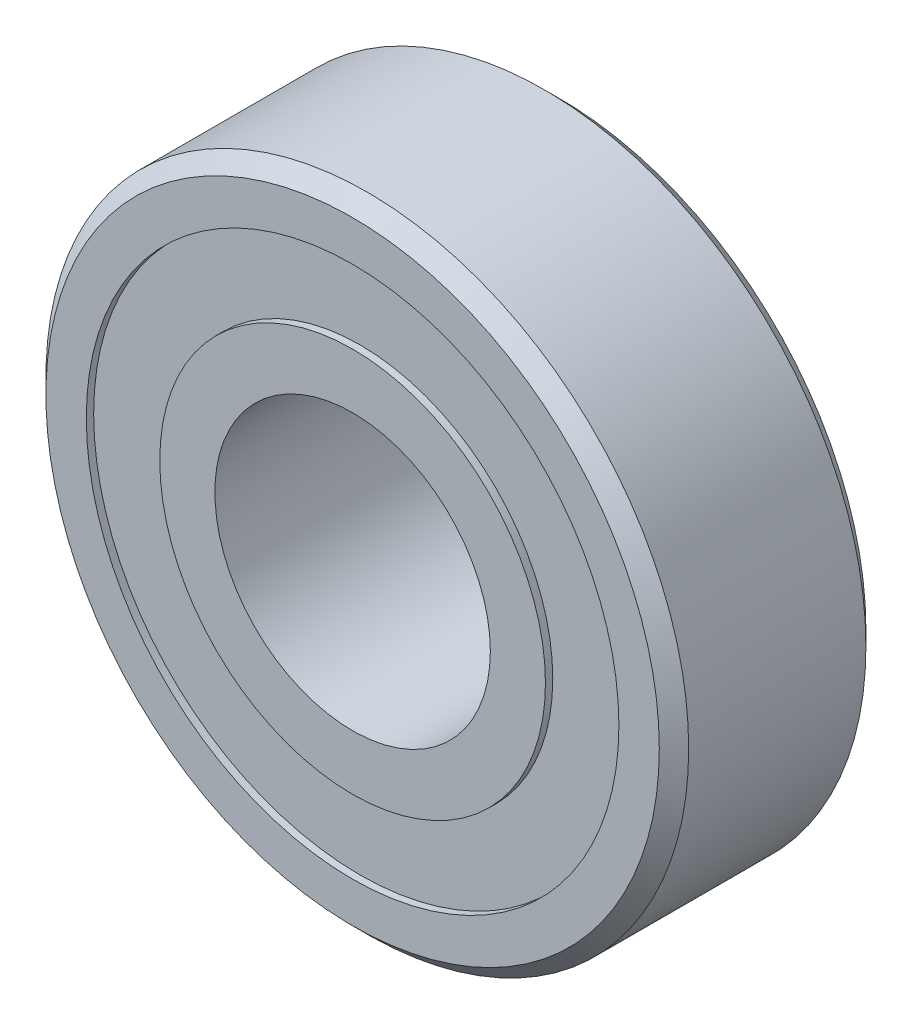
ISO-10303-21;
HEADER;
FILE_DESCRIPTION(('STEP AP214'),'2;1');
FILE_NAME('part.step','',(''),(''),'','','');
FILE_SCHEMA(('AUTOMOTIVE_DESIGN { 1 0 10303 214 1 1 1 1 }'));
ENDSEC;
DATA;
#1=APPLICATION_CONTEXT('core data for automotive mechanical design processes');
#2=APPLICATION_PROTOCOL_DEFINITION('international standard','automotive_design',2000,#1);
#3=PRODUCT_CONTEXT('',#1,'mechanical');
#4=PRODUCT('Part','Part','',(#3));
#5=PRODUCT_RELATED_PRODUCT_CATEGORY('part','',(#4));
#6=PRODUCT_DEFINITION_FORMATION('','',#4);
#7=PRODUCT_DEFINITION_CONTEXT('part definition',#1,'design');
#8=PRODUCT_DEFINITION('design','',#6,#7);
#9=PRODUCT_DEFINITION_SHAPE('','',#8);
#10=(LENGTH_UNIT() NAMED_UNIT(*) SI_UNIT(.MILLI.,.METRE.));
#11=(NAMED_UNIT(*) PLANE_ANGLE_UNIT() SI_UNIT($,.RADIAN.));
#12=(NAMED_UNIT(*) SI_UNIT($,.STERADIAN.) SOLID_ANGLE_UNIT());
#13=UNCERTAINTY_MEASURE_WITH_UNIT(LENGTH_MEASURE(1.E-05),#10,'distance_accuracy_value','');
#14=(GEOMETRIC_REPRESENTATION_CONTEXT(3) GLOBAL_UNCERTAINTY_ASSIGNED_CONTEXT((#13)) GLOBAL_UNIT_ASSIGNED_CONTEXT((#10,
#11,#12)) REPRESENTATION_CONTEXT('',''));
#15=CARTESIAN_POINT('',(0.,0.,0.));
#16=DIRECTION('',(0.,0.,1.));
#17=DIRECTION('',(1.,0.,0.));
#18=AXIS2_PLACEMENT_3D('',#15,#16,#17);
#19=CARTESIAN_POINT('',(0.,0.,0.));
#20=DIRECTION('',(0.,0.,1.));
#21=DIRECTION('',(1.,0.,0.));
#22=AXIS2_PLACEMENT_3D('',#19,#20,#21);
#23=PLANE('',#22);
#24=CARTESIAN_POINT('',(0.,0.,0.));
#25=DIRECTION('',(0.,0.,1.));
#26=DIRECTION('',(1.,0.,0.));
#27=AXIS2_PLACEMENT_3D('',#24,#25,#26);
#28=CIRCLE('',#27,4.76249999999998);
#29=CARTESIAN_POINT('',(4.76249999999998,0.,0.));
#30=VERTEX_POINT('',#29);
#31=EDGE_CURVE('E53',#30,#30,#28,.T.);
#32=ORIENTED_EDGE('',*,*,#31,.T.);
#33=EDGE_LOOP('',(#32));
#34=FACE_BOUND('',#33,.T.);
#35=CARTESIAN_POINT('',(0.,0.,0.));
#36=DIRECTION('',(0.,0.,-1.));
#37=DIRECTION('',(-1.,0.,0.));
#38=AXIS2_PLACEMENT_3D('',#35,#36,#37);
#39=CIRCLE('',#38,6.6675);
#40=CARTESIAN_POINT('',(-6.6675,0.,0.));
#41=VERTEX_POINT('',#40);
#42=EDGE_CURVE('E78',#41,#41,#39,.T.);
#43=ORIENTED_EDGE('',*,*,#42,.T.);
#44=EDGE_LOOP('',(#43));
#45=FACE_BOUND('',#44,.T.);
#46=ADVANCED_FACE('F33',(#34,#45),#23,.F.);
#47=CARTESIAN_POINT('',(0.,0.,7.14375));
#48=DIRECTION('',(0.,0.,1.));
#49=DIRECTION('',(1.,0.,0.));
#50=AXIS2_PLACEMENT_3D('',#47,#48,#49);
#51=PLANE('',#50);
#52=CARTESIAN_POINT('',(0.,0.,7.14375));
#53=DIRECTION('',(0.,0.,1.));
#54=DIRECTION('',(1.,0.,0.));
#55=AXIS2_PLACEMENT_3D('',#52,#53,#54);
#56=CIRCLE('',#55,4.76249999999999);
#57=CARTESIAN_POINT('',(4.76249999999999,0.,7.14375));
#58=VERTEX_POINT('',#57);
#59=EDGE_CURVE('E56',#58,#58,#56,.T.);
#60=ORIENTED_EDGE('',*,*,#59,.F.);
#61=EDGE_LOOP('',(#60));
#62=FACE_BOUND('',#61,.T.);
#63=CARTESIAN_POINT('',(0.,0.,7.14375));
#64=DIRECTION('',(0.,0.,1.));
#65=DIRECTION('',(1.,0.,0.));
#66=AXIS2_PLACEMENT_3D('',#63,#64,#65);
#67=CIRCLE('',#66,6.6675);
#68=CARTESIAN_POINT('',(6.6675,0.,7.14375));
#69=VERTEX_POINT('',#68);
#70=EDGE_CURVE('E66',#69,#69,#67,.T.);
#71=ORIENTED_EDGE('',*,*,#70,.T.);
#72=EDGE_LOOP('',(#71));
#73=FACE_BOUND('',#72,.T.);
#74=ADVANCED_FACE('F113',(#62,#73),#51,.T.);
#75=CARTESIAN_POINT('',(0.,0.,7.14375));
#76=DIRECTION('',(0.,0.,-1.));
#77=DIRECTION('',(-1.,0.,0.));
#78=AXIS2_PLACEMENT_3D('',#75,#76,#77);
#79=CYLINDRICAL_SURFACE('',#78,11.1125);
#80=CARTESIAN_POINT('',(0.,0.,0.507999999999996));
#81=DIRECTION('',(0.,0.,1.));
#82=DIRECTION('',(1.,0.,0.));
#83=AXIS2_PLACEMENT_3D('',#80,#81,#82);
#84=CIRCLE('',#83,11.1125);
#85=CARTESIAN_POINT('',(11.1125,0.,0.507999999999996));
#86=VERTEX_POINT('',#85);
#87=EDGE_CURVE('E44',#86,#86,#84,.T.);
#88=ORIENTED_EDGE('',*,*,#87,.T.);
#89=EDGE_LOOP('',(#88));
#90=FACE_BOUND('',#89,.T.);
#91=CARTESIAN_POINT('',(0.,0.,6.63575));
#92=DIRECTION('',(0.,0.,1.));
#93=DIRECTION('',(1.,0.,0.));
#94=AXIS2_PLACEMENT_3D('',#91,#92,#93);
#95=CIRCLE('',#94,11.1125);
#96=CARTESIAN_POINT('',(11.1125,0.,6.63575));
#97=VERTEX_POINT('',#96);
#98=EDGE_CURVE('E48',#97,#97,#95,.F.);
#99=ORIENTED_EDGE('',*,*,#98,.T.);
#100=EDGE_LOOP('',(#99));
#101=FACE_BOUND('',#100,.T.);
#102=ADVANCED_FACE('F110',(#90,#101),#79,.T.);
#103=CARTESIAN_POINT('',(0.,0.,7.14375));
#104=DIRECTION('',(0.,0.,1.));
#105=DIRECTION('',(1.,0.,0.));
#106=AXIS2_PLACEMENT_3D('',#103,#104,#105);
#107=CIRCLE('',#106,9.2075);
#108=CARTESIAN_POINT('',(9.2075,0.,7.14375));
#109=VERTEX_POINT('',#108);
#110=EDGE_CURVE('E60',#109,#109,#107,.T.);
#111=ORIENTED_EDGE('',*,*,#110,.F.);
#112=EDGE_LOOP('',(#111));
#113=FACE_BOUND('',#112,.T.);
#114=CARTESIAN_POINT('',(0.,0.,7.14375));
#115=DIRECTION('',(0.,0.,1.));
#116=DIRECTION('',(1.,0.,0.));
#117=AXIS2_PLACEMENT_3D('',#114,#115,#116);
#118=CIRCLE('',#117,10.6045);
#119=CARTESIAN_POINT('',(10.6045,0.,7.14375));
#120=VERTEX_POINT('',#119);
#121=EDGE_CURVE('E10',#120,#120,#118,.T.);
#122=ORIENTED_EDGE('',*,*,#121,.T.);
#123=EDGE_LOOP('',(#122));
#124=FACE_BOUND('',#123,.T.);
#125=ADVANCED_FACE('F103',(#113,#124),#51,.T.);
#126=CARTESIAN_POINT('',(0.,0.,0.));
#127=DIRECTION('',(0.,0.,-1.));
#128=DIRECTION('',(-1.,0.,0.));
#129=AXIS2_PLACEMENT_3D('',#126,#127,#128);
#130=CIRCLE('',#129,9.2075);
#131=CARTESIAN_POINT('',(-9.2075,0.,0.));
#132=VERTEX_POINT('',#131);
#133=EDGE_CURVE('E72',#132,#132,#130,.T.);
#134=ORIENTED_EDGE('',*,*,#133,.F.);
#135=EDGE_LOOP('',(#134));
#136=FACE_BOUND('',#135,.T.);
#137=CARTESIAN_POINT('',(0.,0.,0.));
#138=DIRECTION('',(0.,0.,1.));
#139=DIRECTION('',(1.,0.,0.));
#140=AXIS2_PLACEMENT_3D('',#137,#138,#139);
#141=CIRCLE('',#140,10.6045);
#142=CARTESIAN_POINT('',(10.6045,0.,0.));
#143=VERTEX_POINT('',#142);
#144=EDGE_CURVE('E40',#143,#143,#141,.F.);
#145=ORIENTED_EDGE('',*,*,#144,.T.);
#146=EDGE_LOOP('',(#145));
#147=FACE_BOUND('',#146,.T.);
#148=ADVANCED_FACE('F100',(#136,#147),#23,.F.);
#149=CARTESIAN_POINT('',(0.,0.,0.507999999999996));
#150=DIRECTION('',(0.,0.,1.));
#151=DIRECTION('',(1.,0.,0.));
#152=AXIS2_PLACEMENT_3D('',#149,#150,#151);
#153=CONICAL_SURFACE('',#152,11.1125,0.785398163397452);
#154=ORIENTED_EDGE('',*,*,#144,.F.);
#155=EDGE_LOOP('',(#154));
#156=FACE_BOUND('',#155,.T.);
#157=ORIENTED_EDGE('',*,*,#87,.F.);
#158=EDGE_LOOP('',(#157));
#159=FACE_BOUND('',#158,.T.);
#160=ADVANCED_FACE('F102',(#156,#159),#153,.T.);
#161=CARTESIAN_POINT('',(0.,0.,7.14375));
#162=DIRECTION('',(0.,0.,-1.));
#163=DIRECTION('',(-1.,0.,0.));
#164=AXIS2_PLACEMENT_3D('',#161,#162,#163);
#165=CONICAL_SURFACE('',#164,10.6045,0.785398163397448);
#166=ORIENTED_EDGE('',*,*,#98,.F.);
#167=EDGE_LOOP('',(#166));
#168=FACE_BOUND('',#167,.T.);
#169=ORIENTED_EDGE('',*,*,#121,.F.);
#170=EDGE_LOOP('',(#169));
#171=FACE_BOUND('',#170,.T.);
#172=ADVANCED_FACE('F35',(#168,#171),#165,.T.);
#173=CARTESIAN_POINT('',(0.,0.,7.14375));
#174=DIRECTION('',(0.,0.,1.));
#175=DIRECTION('',(1.,0.,0.));
#176=AXIS2_PLACEMENT_3D('',#173,#174,#175);
#177=CYLINDRICAL_SURFACE('',#176,4.76249999999999);
#178=ORIENTED_EDGE('',*,*,#31,.F.);
#179=EDGE_LOOP('',(#178));
#180=FACE_BOUND('',#179,.T.);
#181=ORIENTED_EDGE('',*,*,#59,.T.);
#182=EDGE_LOOP('',(#181));
#183=FACE_BOUND('',#182,.T.);
#184=ADVANCED_FACE('F139',(#180,#183),#177,.F.);
#185=CARTESIAN_POINT('',(0.,0.,6.88975));
#186=DIRECTION('',(0.,0.,1.));
#187=DIRECTION('',(1.,0.,0.));
#188=AXIS2_PLACEMENT_3D('',#185,#186,#187);
#189=CYLINDRICAL_SURFACE('',#188,9.2075);
#190=CARTESIAN_POINT('',(0.,0.,6.88975));
#191=DIRECTION('',(0.,0.,1.));
#192=DIRECTION('',(1.,0.,0.));
#193=AXIS2_PLACEMENT_3D('',#190,#191,#192);
#194=CIRCLE('',#193,9.2075);
#195=CARTESIAN_POINT('',(9.2075,0.,6.88975));
#196=VERTEX_POINT('',#195);
#197=EDGE_CURVE('E59',#196,#196,#194,.T.);
#198=ORIENTED_EDGE('',*,*,#197,.F.);
#199=EDGE_LOOP('',(#198));
#200=FACE_BOUND('',#199,.T.);
#201=ORIENTED_EDGE('',*,*,#110,.T.);
#202=EDGE_LOOP('',(#201));
#203=FACE_BOUND('',#202,.T.);
#204=ADVANCED_FACE('F135',(#200,#203),#189,.F.);
#205=CARTESIAN_POINT('',(0.,0.,6.88975));
#206=DIRECTION('',(0.,0.,1.));
#207=DIRECTION('',(1.,0.,0.));
#208=AXIS2_PLACEMENT_3D('',#205,#206,#207);
#209=PLANE('',#208);
#210=CARTESIAN_POINT('',(0.,0.,6.88975));
#211=DIRECTION('',(0.,0.,1.));
#212=DIRECTION('',(1.,0.,0.));
#213=AXIS2_PLACEMENT_3D('',#210,#211,#212);
#214=CIRCLE('',#213,6.6675);
#215=CARTESIAN_POINT('',(6.6675,0.,6.88975));
#216=VERTEX_POINT('',#215);
#217=EDGE_CURVE('E63',#216,#216,#214,.T.);
#218=ORIENTED_EDGE('',*,*,#217,.F.);
#219=EDGE_LOOP('',(#218));
#220=FACE_BOUND('',#219,.T.);
#221=ORIENTED_EDGE('',*,*,#197,.T.);
#222=EDGE_LOOP('',(#221));
#223=FACE_BOUND('',#222,.T.);
#224=ADVANCED_FACE('F131',(#220,#223),#209,.T.);
#225=CARTESIAN_POINT('',(0.,0.,6.88975));
#226=DIRECTION('',(0.,0.,1.));
#227=DIRECTION('',(1.,0.,0.));
#228=AXIS2_PLACEMENT_3D('',#225,#226,#227);
#229=CYLINDRICAL_SURFACE('',#228,6.6675);
#230=ORIENTED_EDGE('',*,*,#217,.T.);
#231=EDGE_LOOP('',(#230));
#232=FACE_BOUND('',#231,.T.);
#233=ORIENTED_EDGE('',*,*,#70,.F.);
#234=EDGE_LOOP('',(#233));
#235=FACE_BOUND('',#234,.T.);
#236=ADVANCED_FACE('F96',(#232,#235),#229,.T.);
#237=CARTESIAN_POINT('',(0.,0.,0.254));
#238=DIRECTION('',(0.,0.,-1.));
#239=DIRECTION('',(-1.,0.,0.));
#240=AXIS2_PLACEMENT_3D('',#237,#238,#239);
#241=CYLINDRICAL_SURFACE('',#240,9.2075);
#242=CARTESIAN_POINT('',(0.,0.,0.254));
#243=DIRECTION('',(0.,0.,-1.));
#244=DIRECTION('',(-1.,0.,0.));
#245=AXIS2_PLACEMENT_3D('',#242,#243,#244);
#246=CIRCLE('',#245,9.2075);
#247=CARTESIAN_POINT('',(-9.2075,0.,0.254));
#248=VERTEX_POINT('',#247);
#249=EDGE_CURVE('E69',#248,#248,#246,.T.);
#250=ORIENTED_EDGE('',*,*,#249,.F.);
#251=EDGE_LOOP('',(#250));
#252=FACE_BOUND('',#251,.T.);
#253=ORIENTED_EDGE('',*,*,#133,.T.);
#254=EDGE_LOOP('',(#253));
#255=FACE_BOUND('',#254,.T.);
#256=ADVANCED_FACE('F90',(#252,#255),#241,.F.);
#257=CARTESIAN_POINT('',(0.,0.,0.254));
#258=DIRECTION('',(0.,0.,-1.));
#259=DIRECTION('',(-1.,0.,0.));
#260=AXIS2_PLACEMENT_3D('',#257,#258,#259);
#261=PLANE('',#260);
#262=CARTESIAN_POINT('',(0.,0.,0.254));
#263=DIRECTION('',(0.,0.,-1.));
#264=DIRECTION('',(-1.,0.,0.));
#265=AXIS2_PLACEMENT_3D('',#262,#263,#264);
#266=CIRCLE('',#265,6.6675);
#267=CARTESIAN_POINT('',(-6.6675,0.,0.254));
#268=VERTEX_POINT('',#267);
#269=EDGE_CURVE('E75',#268,#268,#266,.T.);
#270=ORIENTED_EDGE('',*,*,#269,.F.);
#271=EDGE_LOOP('',(#270));
#272=FACE_BOUND('',#271,.T.);
#273=ORIENTED_EDGE('',*,*,#249,.T.);
#274=EDGE_LOOP('',(#273));
#275=FACE_BOUND('',#274,.T.);
#276=ADVANCED_FACE('F87',(#272,#275),#261,.T.);
#277=CARTESIAN_POINT('',(0.,0.,0.254));
#278=DIRECTION('',(0.,0.,-1.));
#279=DIRECTION('',(-1.,0.,0.));
#280=AXIS2_PLACEMENT_3D('',#277,#278,#279);
#281=CYLINDRICAL_SURFACE('',#280,6.6675);
#282=ORIENTED_EDGE('',*,*,#269,.T.);
#283=EDGE_LOOP('',(#282));
#284=FACE_BOUND('',#283,.T.);
#285=ORIENTED_EDGE('',*,*,#42,.F.);
#286=EDGE_LOOP('',(#285));
#287=FACE_BOUND('',#286,.T.);
#288=ADVANCED_FACE('F84',(#284,#287),#281,.T.);
#289=CLOSED_SHELL('',(#46,#74,#102,#125,#148,#160,#172,#184,#204,#224,#236,#256,#276,#288));
#290=MANIFOLD_SOLID_BREP('B2',#289);
#291=ADVANCED_BREP_SHAPE_REPRESENTATION('',(#18,#290),#14);
#292=SHAPE_DEFINITION_REPRESENTATION(#9,#291);
ENDSEC;
END-ISO-10303-21;
